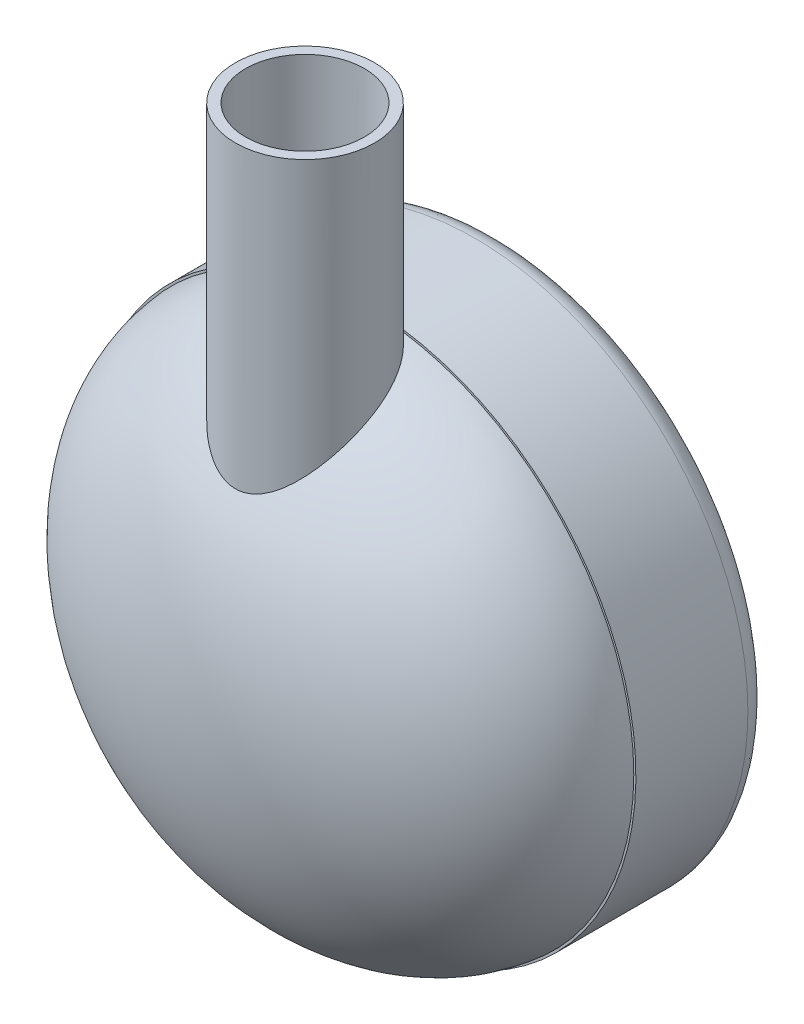
ISO-10303-21;
HEADER;
FILE_DESCRIPTION(('STEP AP214'),'2;1');
FILE_NAME('part.step','',(''),(''),'','','');
FILE_SCHEMA(('AUTOMOTIVE_DESIGN { 1 0 10303 214 1 1 1 1 }'));
ENDSEC;
DATA;
#1=APPLICATION_CONTEXT('core data for automotive mechanical design processes');
#2=APPLICATION_PROTOCOL_DEFINITION('international standard','automotive_design',2000,#1);
#3=PRODUCT_CONTEXT('',#1,'mechanical');
#4=PRODUCT('Part','Part','',(#3));
#5=PRODUCT_RELATED_PRODUCT_CATEGORY('part','',(#4));
#6=PRODUCT_DEFINITION_FORMATION('','',#4);
#7=PRODUCT_DEFINITION_CONTEXT('part definition',#1,'design');
#8=PRODUCT_DEFINITION('design','',#6,#7);
#9=PRODUCT_DEFINITION_SHAPE('','',#8);
#10=(LENGTH_UNIT() NAMED_UNIT(*) SI_UNIT(.MILLI.,.METRE.));
#11=(NAMED_UNIT(*) PLANE_ANGLE_UNIT() SI_UNIT($,.RADIAN.));
#12=(NAMED_UNIT(*) SI_UNIT($,.STERADIAN.) SOLID_ANGLE_UNIT());
#13=UNCERTAINTY_MEASURE_WITH_UNIT(LENGTH_MEASURE(1.E-05),#10,'distance_accuracy_value','');
#14=(GEOMETRIC_REPRESENTATION_CONTEXT(3) GLOBAL_UNCERTAINTY_ASSIGNED_CONTEXT((#13)) GLOBAL_UNIT_ASSIGNED_CONTEXT((#10,
#11,#12)) REPRESENTATION_CONTEXT('',''));
#15=CARTESIAN_POINT('',(0.,0.,0.));
#16=DIRECTION('',(0.,0.,1.));
#17=DIRECTION('',(1.,0.,0.));
#18=AXIS2_PLACEMENT_3D('',#15,#16,#17);
#19=CARTESIAN_POINT('',(0.,0.,45.));
#20=DIRECTION('',(0.,0.,-1.));
#21=DIRECTION('',(-1.,0.,0.));
#22=AXIS2_PLACEMENT_3D('',#19,#20,#21);
#23=CYLINDRICAL_SURFACE('',#22,120.75);
#24=CARTESIAN_POINT('',(0.,0.,0.));
#25=DIRECTION('',(0.,0.,-1.));
#26=DIRECTION('',(-1.,0.,0.));
#27=AXIS2_PLACEMENT_3D('',#24,#25,#26);
#28=CIRCLE('',#27,120.75);
#29=CARTESIAN_POINT('',(-120.75,0.,0.));
#30=VERTEX_POINT('',#29);
#31=EDGE_CURVE('E157',#30,#30,#28,.F.);
#32=ORIENTED_EDGE('',*,*,#31,.T.);
#33=EDGE_LOOP('',(#32));
#34=FACE_BOUND('',#33,.T.);
#35=CARTESIAN_POINT('',(17.1846588560844,119.520918671168,49.5));
#36=CARTESIAN_POINT('',(16.8331317271554,119.571462089514,49.2631043339135));
#37=CARTESIAN_POINT('',(16.4766605983604,119.62113092861,49.0334458264158));
#38=CARTESIAN_POINT('',(15.7543172902468,119.718406265614,48.58894383915));
#39=CARTESIAN_POINT('',(15.38844497596,119.766012733886,48.3741005722405));
#40=CARTESIAN_POINT('',(14.2775585035009,119.905255814066,47.7523629909278));
#41=CARTESIAN_POINT('',(13.5191925403778,119.993328044487,47.3682054450091));
#42=CARTESIAN_POINT('',(11.9721185922926,120.157547566686,46.6635619864697));
#43=CARTESIAN_POINT('',(11.183404958892,120.233692625022,46.3430879960006));
#44=CARTESIAN_POINT('',(9.58103277847739,120.371976729414,45.7683282808845));
#45=CARTESIAN_POINT('',(8.767375648652,120.434116569521,45.514038803663));
#46=CARTESIAN_POINT('',(7.11975880411299,120.542747381812,45.073429184804));
#47=CARTESIAN_POINT('',(6.28577540860014,120.58921906402,44.8871928038176));
#48=CARTESIAN_POINT('',(4.60441577754682,120.665115064772,44.5846836838166));
#49=CARTESIAN_POINT('',(3.75703919370377,120.69453893922,44.4684127674028));
#50=CARTESIAN_POINT('',(2.0556109289948,120.735498751539,44.3068936945759));
#51=CARTESIAN_POINT('',(1.20156343729171,120.747045130363,44.2616040829242));
#52=CARTESIAN_POINT('',(-0.507361239728997,120.751957110458,44.2423140637511));
#53=CARTESIAN_POINT('',(-1.362238392966,120.745323388733,44.2683110016084));
#54=CARTESIAN_POINT('',(-3.0524350075147,120.714323042628,44.3903419533874));
#55=CARTESIAN_POINT('',(-3.8878442359368,120.69025121979,44.485211687873));
#56=CARTESIAN_POINT('',(-5.54750209458255,120.625360044033,44.7428849386943));
#57=CARTESIAN_POINT('',(-6.37175004546557,120.584539676389,44.9056925711096));
#58=CARTESIAN_POINT('',(-8.00327374212154,120.48725189432,45.2979137992242));
#59=CARTESIAN_POINT('',(-8.81055015422372,120.430785095437,45.5273247747149));
#60=CARTESIAN_POINT('',(-10.4023796465315,120.303743645905,46.050818627233));
#61=CARTESIAN_POINT('',(-11.1869386507159,120.233172711797,46.3448844692769));
#62=CARTESIAN_POINT('',(-12.874319527206,120.06523963759,47.0571419790517));
#63=CARTESIAN_POINT('',(-13.7714818434274,119.965334833389,47.4882880818536));
#64=CARTESIAN_POINT('',(-15.0804306161338,119.805410419278,48.197220221686));
#65=CARTESIAN_POINT('',(-15.5101725119268,119.750488788359,48.4436018574173));
#66=CARTESIAN_POINT('',(-16.3570711100357,119.637749819806,48.9566948745404));
#67=CARTESIAN_POINT('',(-16.774225305514,119.579931911398,49.2234102685832));
#68=CARTESIAN_POINT('',(-17.1846588560844,119.520918671168,49.5));
#69=B_SPLINE_CURVE_WITH_KNOTS('',3,(#35,#36,#37,#38,#39,#40,#41,#42,#43,#44,#45,#46,#47,#48,#49,
#50,#51,#52,#53,#54,#55,#56,#57,#58,#59,#60,#61,#62,#63,#64,#65,#66,#67,#68),.UNSPECIFIED.,.F.,
.F.,(4,2,2,2,2,2,2,2,2,2,2,2,2,2,2,2,4),(0.,1.2805175942582,2.56105358257562,5.12182669012851,
7.68307874742409,10.244185553463,12.8084340697541,15.372749381844,17.935566497049,
20.4982881774684,23.0186674745591,25.5391994933089,28.0596323665073,30.579401961095,
33.5752101749079,35.0699067913225,36.5648991375559),.UNSPECIFIED.);
#70=CARTESIAN_POINT('',(17.1846588560844,119.520918671168,49.5));
#71=VERTEX_POINT('',#70);
#72=CARTESIAN_POINT('',(-17.1846588560844,119.520918671168,49.5));
#73=VERTEX_POINT('',#72);
#74=EDGE_CURVE('E11',#71,#73,#69,.T.);
#75=ORIENTED_EDGE('',*,*,#74,.F.);
#76=CARTESIAN_POINT('',(0.,0.,49.5));
#77=DIRECTION('',(0.,0.,1.));
#78=DIRECTION('',(1.,0.,0.));
#79=AXIS2_PLACEMENT_3D('',#76,#77,#78);
#80=CIRCLE('',#79,120.75);
#81=EDGE_CURVE('E158',#73,#71,#80,.T.);
#82=ORIENTED_EDGE('',*,*,#81,.F.);
#83=EDGE_LOOP('',(#75,#82));
#84=FACE_BOUND('',#83,.T.);
#85=ADVANCED_FACE('F39',(#34,#84),#23,.T.);
#86=CARTESIAN_POINT('',(0.,0.,49.5));
#87=DIRECTION('',(0.,0.,1.));
#88=DIRECTION('',(1.,0.,0.));
#89=AXIS2_PLACEMENT_3D('',#86,#87,#88);
#90=PLANE('',#89);
#91=CARTESIAN_POINT('',(0.,0.,49.5));
#92=DIRECTION('',(0.,0.,1.));
#93=DIRECTION('',(1.,0.,0.));
#94=AXIS2_PLACEMENT_3D('',#91,#92,#93);
#95=CIRCLE('',#94,119.810793454518);
#96=CARTESIAN_POINT('',(17.1846588560844,118.571976993728,49.5));
#97=VERTEX_POINT('',#96);
#98=CARTESIAN_POINT('',(-17.1846588560843,118.571976993728,49.5));
#99=VERTEX_POINT('',#98);
#100=EDGE_CURVE('E162',#97,#99,#95,.F.);
#101=ORIENTED_EDGE('',*,*,#100,.T.);
#102=DIRECTION('',(0.,-1.,0.));
#103=VECTOR('',#102,1.);
#104=CARTESIAN_POINT('',(-17.1846588560844,210.,49.5));
#105=LINE('',#104,#103);
#106=EDGE_CURVE('E54',#99,#73,#105,.F.);
#107=ORIENTED_EDGE('',*,*,#106,.T.);
#108=ORIENTED_EDGE('',*,*,#81,.T.);
#109=DIRECTION('',(0.,-1.,0.));
#110=VECTOR('',#109,1.);
#111=CARTESIAN_POINT('',(17.1846588560844,210.,49.5));
#112=LINE('',#111,#110);
#113=EDGE_CURVE('E172',#71,#97,#112,.T.);
#114=ORIENTED_EDGE('',*,*,#113,.T.);
#115=EDGE_LOOP('',(#101,#107,#108,#114));
#116=FACE_BOUND('',#115,.T.);
#117=ADVANCED_FACE('F134',(#116),#90,.T.);
#118=CARTESIAN_POINT('',(0.,0.,45.015));
#119=DIRECTION('',(0.,1.,0.));
#120=DIRECTION('',(1.,0.,0.));
#121=AXIS2_PLACEMENT_3D('',#118,#119,#120);
#122=ELLIPSE('',#121,115.5,75.);
#123=TRIMMED_CURVE('',#122,(PARAMETER_VALUE(4.71238898038469)),
(PARAMETER_VALUE(7.85398163397448)),.T.,.PARAMETER.);
#124=CARTESIAN_POINT('',(0.,0.,-29.985));
#125=DIRECTION('',(0.,0.,1.));
#126=AXIS1_PLACEMENT('',#124,#125);
#127=SURFACE_OF_REVOLUTION('',#123,#126);
#128=OFFSET_SURFACE('',#127,-4.5,.F.);
#129=ORIENTED_EDGE('',*,*,#100,.F.);
#130=CARTESIAN_POINT('',(1.80989121084306,77.6819857807025,105.69669027444));
#131=CARTESIAN_POINT('',(1.40669043917153,77.648988087684,105.720461887101));
#132=CARTESIAN_POINT('',(1.00209316683736,77.6269195285293,105.736336908205));
#133=CARTESIAN_POINT('',(0.191786023032918,77.605043189585,105.752073809219));
#134=CARTESIAN_POINT('',(-0.213924321867369,77.6052471297828,105.751927258434));
#135=CARTESIAN_POINT('',(-1.02441679202699,77.6279380095596,105.735604089678));
#136=CARTESIAN_POINT('',(-1.42919887620898,77.650425916878,105.719426775529));
#137=CARTESIAN_POINT('',(-2.23661175701627,77.7173367709566,105.671222617045));
#138=CARTESIAN_POINT('',(-2.63923829546314,77.7617933491522,105.639171471585));
#139=CARTESIAN_POINT('',(-3.44001507677279,77.871891643151,105.55962490904));
#140=CARTESIAN_POINT('',(-3.83816552292512,77.9375323927829,105.512130196308));
#141=CARTESIAN_POINT('',(-4.62848091282559,78.0889197979008,105.402284338547));
#142=CARTESIAN_POINT('',(-5.020646201604,78.1746652896971,105.339934053376));
#143=CARTESIAN_POINT('',(-5.98587933731249,78.411067560125,105.167443446823));
#144=CARTESIAN_POINT('',(-6.55468713551867,78.5730595711758,105.048775505419));
#145=CARTESIAN_POINT('',(-7.673423566329,78.9338363336602,104.782745166043));
#146=CARTESIAN_POINT('',(-8.22335206210646,79.1326213516824,104.635382560161));
#147=CARTESIAN_POINT('',(-9.3028549452519,79.5622531006128,104.314444140331));
#148=CARTESIAN_POINT('',(-9.83242009136616,79.7931141739918,104.14085659713));
#149=CARTESIAN_POINT('',(-10.8702169610005,80.282301273951,103.769857602816));
#150=CARTESIAN_POINT('',(-11.3784418220434,80.5406360424255,103.57243856601));
#151=CARTESIAN_POINT('',(-12.267371580735,81.0231044281979,103.200254185229));
#152=CARTESIAN_POINT('',(-12.6522161823482,81.2428328786841,103.029595697287));
#153=CARTESIAN_POINT('',(-13.4084284386805,81.6948126589588,102.67581518848));
#154=CARTESIAN_POINT('',(-13.7797987412217,81.9270615058325,102.492695636888));
#155=CARTESIAN_POINT('',(-14.8744776748682,82.6404206692222,101.925607779527));
#156=CARTESIAN_POINT('',(-15.5780772385715,83.1379907006384,101.524027552144));
#157=CARTESIAN_POINT('',(-16.9358181374531,84.1668161349365,100.678430353881));
#158=CARTESIAN_POINT('',(-17.5898433750881,84.6981455601085,100.234318965262));
#159=CARTESIAN_POINT('',(-18.848995172111,85.7849213077496,99.308198586273));
#160=CARTESIAN_POINT('',(-19.4541240168251,86.3403665012252,98.8261913691639));
#161=CARTESIAN_POINT('',(-20.5915320134628,87.4435312301171,97.8492474790699));
#162=CARTESIAN_POINT('',(-21.1258511231682,87.9905023615386,97.3558303131987));
#163=CARTESIAN_POINT('',(-22.1528473274034,89.0956074096433,96.3386116726273));
#164=CARTESIAN_POINT('',(-22.6455105801531,89.653744961213,95.8148001949717));
#165=CARTESIAN_POINT('',(-23.5897308699754,90.7770595260125,94.7382816614395));
#166=CARTESIAN_POINT('',(-24.0412814527677,91.3422376287606,94.1855700899038));
#167=CARTESIAN_POINT('',(-24.9036654366512,92.4764921797058,93.052074494395));
#168=CARTESIAN_POINT('',(-25.3144704222209,93.045571056648,92.4712712937663));
#169=CARTESIAN_POINT('',(-26.0946329197528,94.1840806896701,91.2830483349029));
#170=CARTESIAN_POINT('',(-26.4639977183918,94.7535113661294,90.6756332821905));
#171=CARTESIAN_POINT('',(-27.1606166593839,95.8900651003905,89.4350082393035));
#172=CARTESIAN_POINT('',(-27.4878713153999,96.4571881862586,88.8017985638979));
#173=CARTESIAN_POINT('',(-28.0253520403908,97.4502976239254,87.6663281103067));
#174=CARTESIAN_POINT('',(-28.2447681525781,97.8773375313495,87.1693141970684));
#175=CARTESIAN_POINT('',(-28.6580166174198,98.727549529245,86.1614184408254));
#176=CARTESIAN_POINT('',(-28.8518466635156,99.1507212678085,85.6505353525267));
#177=CARTESIAN_POINT('',(-29.2131216331597,99.9921231047379,84.6154325915189));
#178=CARTESIAN_POINT('',(-29.3805636161198,100.410352647567,84.0912114400146));
#179=CARTESIAN_POINT('',(-29.6881266761399,101.240756741045,83.0301152363319));
#180=CARTESIAN_POINT('',(-29.8282483651303,101.652931427121,82.4932404678759));
#181=CARTESIAN_POINT('',(-30.0799349795175,102.469434536016,81.4085424899584));
#182=CARTESIAN_POINT('',(-30.1915514195129,102.873775874974,80.8607409875005));
#183=CARTESIAN_POINT('',(-30.3854541067728,103.674277826471,79.7541731183133));
#184=CARTESIAN_POINT('',(-30.4677440587579,104.070439466364,79.1954081459796));
#185=CARTESIAN_POINT('',(-30.6018313761142,104.853485315592,78.0679902488535));
#186=CARTESIAN_POINT('',(-30.6536364878264,105.240371857784,77.4993398738328));
#187=CARTESIAN_POINT('',(-30.7255719350372,106.003860601573,76.3532921326368));
#188=CARTESIAN_POINT('',(-30.7457050156939,106.380463691703,75.7758955289171));
#189=CARTESIAN_POINT('',(-30.7547422595682,107.291921763317,74.3480628718924));
#190=CARTESIAN_POINT('',(-30.7251794727656,107.820480037013,73.4933880701209));
#191=CARTESIAN_POINT('',(-30.5924193548719,108.850321983771,71.7735289978748));
#192=CARTESIAN_POINT('',(-30.4892338054832,109.351610007024,70.9083464307096));
#193=CARTESIAN_POINT('',(-30.205799682476,110.323806582743,69.1738458472711));
#194=CARTESIAN_POINT('',(-30.0255779832139,110.794725663659,68.3045293776094));
#195=CARTESIAN_POINT('',(-29.5850813264832,111.703634683419,66.5686964573215));
#196=CARTESIAN_POINT('',(-29.3248040503778,112.141623668058,65.7021800885287));
#197=CARTESIAN_POINT('',(-28.8213384205952,112.84398222546,64.263707414053));
#198=CARTESIAN_POINT('',(-28.600648545407,113.118102790591,63.6885406434975));
#199=CARTESIAN_POINT('',(-28.1219787154833,113.64987323533,62.5460736744658));
#200=CARTESIAN_POINT('',(-27.8639978486577,113.907522711854,61.9787736687727));
#201=CARTESIAN_POINT('',(-27.3106979216999,114.405877991641,60.8550166830319));
#202=CARTESIAN_POINT('',(-27.0153780143282,114.646583410243,60.2985599493536));
#203=CARTESIAN_POINT('',(-26.3877624974977,115.110672276387,59.1997256146788));
#204=CARTESIAN_POINT('',(-26.0554801166479,115.33406187288,58.6573430617937));
#205=CARTESIAN_POINT('',(-25.3544120301639,115.76347682655,57.5895387199744));
#206=CARTESIAN_POINT('',(-24.9856265892381,115.969502309625,57.0641168080838));
#207=CARTESIAN_POINT('',(-24.2125303361332,116.364178730038,56.0334258872613));
#208=CARTESIAN_POINT('',(-23.8082245286772,116.552832107411,55.5281540537774));
#209=CARTESIAN_POINT('',(-22.8270793940527,116.971992147876,54.3789111764738));
#210=CARTESIAN_POINT('',(-22.2370961716108,117.195974600735,53.7437024275815));
#211=CARTESIAN_POINT('',(-21.000236318134,117.614482630452,52.5209219692862));
#212=CARTESIAN_POINT('',(-20.3533642438159,117.809010563185,51.9333464517607));
#213=CARTESIAN_POINT('',(-19.007333264297,118.169817002312,50.8121776571229));
#214=CARTESIAN_POINT('',(-18.3081867430122,118.336102169124,50.2785716645585));
#215=CARTESIAN_POINT('',(-16.8627363441075,118.641941986431,49.2708964333779));
#216=CARTESIAN_POINT('',(-16.1164334823478,118.781497212491,48.7968259128824));
#217=CARTESIAN_POINT('',(-14.6258590513366,119.028319065918,47.9381392908444));
#218=CARTESIAN_POINT('',(-13.8838506842341,119.136963616934,47.5499842936186));
#219=CARTESIAN_POINT('',(-12.3683700370362,119.33326197722,46.834631978436));
#220=CARTESIAN_POINT('',(-11.5948992010565,119.420916748645,46.5074318665103));
#221=CARTESIAN_POINT('',(-10.0220875552169,119.576520084698,45.916914567264));
#222=CARTESIAN_POINT('',(-9.22274841937384,119.644469921669,45.653593255483));
#223=CARTESIAN_POINT('',(-7.60389972672945,119.761794555705,45.1930981965814));
#224=CARTESIAN_POINT('',(-6.78438999842554,119.811169194774,44.9959250121009));
#225=CARTESIAN_POINT('',(-5.13632115069617,119.891977278374,44.6704469382079));
#226=CARTESIAN_POINT('',(-4.30785157266456,119.923521796227,44.5417159910169));
#227=CARTESIAN_POINT('',(-2.64270860955412,119.969744129351,44.352312834691));
#228=CARTESIAN_POINT('',(-1.80603528542958,119.984422069846,44.2916401202658));
#229=CARTESIAN_POINT('',(-0.130385699817487,119.997199183182,44.2388530184595));
#230=CARTESIAN_POINT('',(0.708590608816866,119.995298014045,44.2467400452595));
#231=CARTESIAN_POINT('',(2.38289575321601,119.97487849947,44.331010630303));
#232=CARTESIAN_POINT('',(3.21822457735905,119.956360101124,44.4073944066337));
#233=CARTESIAN_POINT('',(4.88114060865462,119.902286146119,44.6282694046959));
#234=CARTESIAN_POINT('',(5.70870681825982,119.866693311754,44.7729096358015));
#235=CARTESIAN_POINT('',(7.34833445032561,119.777786587757,45.12913970604));
#236=CARTESIAN_POINT('',(8.16039586348807,119.724472687497,45.3407295853206));
#237=CARTESIAN_POINT('',(9.76318493549764,119.599189000412,45.8290464533183));
#238=CARTESIAN_POINT('',(10.5539133776987,119.527219899646,46.1057710466278));
#239=CARTESIAN_POINT('',(12.1084157333329,119.363474102666,46.7219556098767));
#240=CARTESIAN_POINT('',(12.8721897271162,119.271697465505,47.0614153927861));
#241=CARTESIAN_POINT('',(14.3661897755792,119.067200128134,47.7994815699164));
#242=CARTESIAN_POINT('',(15.0964659113372,118.954512055034,48.1979956320733));
#243=CARTESIAN_POINT('',(16.5196003557735,118.706749443258,49.050944153048));
#244=CARTESIAN_POINT('',(17.2124588045098,118.571674988384,49.5053784025303));
#245=CARTESIAN_POINT('',(18.5559395687081,118.277835716534,50.4659130610367));
#246=CARTESIAN_POINT('',(19.2065663056842,118.119073385356,50.9720080470412));
#247=CARTESIAN_POINT('',(20.4613871765184,117.776654010937,52.0311466701762));
#248=CARTESIAN_POINT('',(21.0655813147189,117.592996970024,52.5841903029162));
#249=CARTESIAN_POINT('',(22.224312254952,117.199646415238,53.7324591480665));
#250=CARTESIAN_POINT('',(22.7788077046281,116.989931559573,54.3277187625389));
#251=CARTESIAN_POINT('',(23.8345324123773,116.5438976485,55.5543734762603));
#252=CARTESIAN_POINT('',(24.3357619162907,116.307578715888,56.1857684087119));
#253=CARTESIAN_POINT('',(25.2826499662419,115.807998801254,57.4788053208395));
#254=CARTESIAN_POINT('',(25.7283087251077,115.544737922422,58.1404471846609));
#255=CARTESIAN_POINT('',(26.5625364542161,114.991317676626,59.4879987835267));
#256=CARTESIAN_POINT('',(26.9511042047193,114.701157735184,60.1739090366727));
#257=CARTESIAN_POINT('',(27.6813494055378,114.085130858031,61.5852414686752));
#258=CARTESIAN_POINT('',(28.0212391598422,113.758445782259,62.3112308205877));
#259=CARTESIAN_POINT('',(28.6395961449899,113.077858563005,63.7764346517828));
#260=CARTESIAN_POINT('',(28.9180624436534,112.723956006572,64.5156493315927));
#261=CARTESIAN_POINT('',(29.414381793041,111.990091903199,66.0016416826106));
#262=CARTESIAN_POINT('',(29.6322200665523,111.610124031291,66.7484211517403));
#263=CARTESIAN_POINT('',(30.0085720545267,110.825747723633,68.2440502316187));
#264=CARTESIAN_POINT('',(30.1670831935345,110.42133822773,68.9928999308171));
#265=CARTESIAN_POINT('',(30.4390323572864,109.550080910936,70.5594201880532));
#266=CARTESIAN_POINT('',(30.546712623055,109.080960045725,71.3768259353888));
#267=CARTESIAN_POINT('',(30.6959527849908,108.11804295037,73.0030376130043));
#268=CARTESIAN_POINT('',(30.737508996098,107.624245346586,73.8118430614992));
#269=CARTESIAN_POINT('',(30.7576499603902,106.614541953106,75.4165190952669));
#270=CARTESIAN_POINT('',(30.7362201907736,106.098631091739,76.2123866548833));
#271=CARTESIAN_POINT('',(30.6335803417831,105.047538958255,77.7873111592285));
#272=CARTESIAN_POINT('',(30.5523673392081,104.51235674505,78.5663672800164));
#273=CARTESIAN_POINT('',(30.3149731710234,103.334603272388,80.233276075383));
#274=CARTESIAN_POINT('',(30.1485320655086,102.689031512063,81.1175541903192));
#275=CARTESIAN_POINT('',(29.7430784790947,101.379695372433,82.8554550206369));
#276=CARTESIAN_POINT('',(29.504058672246,100.715929162772,83.7090746316789));
#277=CARTESIAN_POINT('',(28.9571615262657,99.3738072891922,85.3837442814458));
#278=CARTESIAN_POINT('',(28.649204563488,98.6954355811954,86.204755355157));
#279=CARTESIAN_POINT('',(27.9678784909189,97.3292064028397,87.8109875318415));
#280=CARTESIAN_POINT('',(27.5945075354592,96.6413486653351,88.5962076241775));
#281=CARTESIAN_POINT('',(26.8681570601291,95.4028247106367,89.9712558843057));
#282=CARTESIAN_POINT('',(26.5267798732931,94.8530416353658,90.5680528984697));
#283=CARTESIAN_POINT('',(25.8050878286605,93.7527413547414,91.7371420837408));
#284=CARTESIAN_POINT('',(25.4247674639174,93.2022240564553,92.3094307728582));
#285=CARTESIAN_POINT('',(24.6255994984597,92.1030651551525,93.4286548917379));
#286=CARTESIAN_POINT('',(24.2067431760277,91.5544240060443,93.9755845397375));
#287=CARTESIAN_POINT('',(23.3308424825444,90.4623670721967,95.0427182150438));
#288=CARTESIAN_POINT('',(22.873818282027,89.9189486945947,95.5629361268604));
#289=CARTESIAN_POINT('',(21.9211046026771,88.8405229152736,96.5757027187412));
#290=CARTESIAN_POINT('',(21.425422911483,88.3055138454401,97.0682569375036));
#291=CARTESIAN_POINT('',(20.3946931635759,87.2479568520541,98.0241802501265));
#292=CARTESIAN_POINT('',(19.8596606166976,86.7254041253226,98.487560710354));
#293=CARTESIAN_POINT('',(18.7715779226584,85.7183777244785,99.3651117504399));
#294=CARTESIAN_POINT('',(18.2201619989749,85.2332209225829,99.7805202862638));
#295=CARTESIAN_POINT('',(17.0784415608994,84.2837300118062,100.580760344029));
#296=CARTESIAN_POINT('',(16.4881377656024,83.8193955181562,100.965592431084));
#297=CARTESIAN_POINT('',(15.2677739941574,82.9184213453848,101.701399782235));
#298=CARTESIAN_POINT('',(14.6377580077186,82.4817520604116,102.052411456149));
#299=CARTESIAN_POINT('',(13.33608708406,81.6435312046969,102.717233338622));
#300=CARTESIAN_POINT('',(12.6644456021872,81.2419683860073,103.031055474078));
#301=CARTESIAN_POINT('',(11.4654103017645,80.5857652626005,103.537850273421));
#302=CARTESIAN_POINT('',(10.9478613988872,80.3206752255197,103.740612589813));
#303=CARTESIAN_POINT('',(9.89027081333018,79.8188230045038,104.121484208536));
#304=CARTESIAN_POINT('',(9.35022857251082,79.5820615240662,104.299592898648));
#305=CARTESIAN_POINT('',(8.2500014401465,79.1423368399254,104.628175644279));
#306=CARTESIAN_POINT('',(7.6898698003252,78.9392913063061,104.778717110673));
#307=CARTESIAN_POINT('',(6.55022443825492,78.5714708970443,105.049952576066));
#308=CARTESIAN_POINT('',(5.97072037042059,78.4066772741586,105.170661198014));
#309=CARTESIAN_POINT('',(5.09201776287559,78.1925046706985,105.326909991042));
#310=CARTESIAN_POINT('',(4.79885634846773,78.1268349242314,105.374700180671));
#311=CARTESIAN_POINT('',(4.20905701878583,78.006621166336,105.462028008659));
#312=CARTESIAN_POINT('',(3.91241955615468,77.952075722983,105.501566709168));
#313=CARTESIAN_POINT('',(3.31610292600799,77.8545711024999,105.57214664402));
#314=CARTESIAN_POINT('',(3.01642246251066,77.8116170969386,105.603184085582));
#315=CARTESIAN_POINT('',(2.41472142050117,77.7377134111939,105.656530867552));
#316=CARTESIAN_POINT('',(2.11270014295983,77.7067674698441,105.678837489549));
#317=CARTESIAN_POINT('',(1.80989121084306,77.6819857807025,105.69669027444));
#318=B_SPLINE_CURVE_WITH_KNOTS('',3,(#130,#131,#132,#133,#134,#135,#136,#137,#138,#139,#140,
#141,#142,#143,#144,#145,#146,#147,#148,#149,#150,#151,#152,#153,#154,#155,#156,#157,#158,#159,
#160,#161,#162,#163,#164,#165,#166,#167,#168,#169,#170,#171,#172,#173,#174,#175,#176,#177,#178,
#179,#180,#181,#182,#183,#184,#185,#186,#187,#188,#189,#190,#191,#192,#193,#194,#195,#196,#197,
#198,#199,#200,#201,#202,#203,#204,#205,#206,#207,#208,#209,#210,#211,#212,#213,#214,#215,#216,
#217,#218,#219,#220,#221,#222,#223,#224,#225,#226,#227,#228,#229,#230,#231,#232,#233,#234,#235,
#236,#237,#238,#239,#240,#241,#242,#243,#244,#245,#246,#247,#248,#249,#250,#251,#252,#253,#254,
#255,#256,#257,#258,#259,#260,#261,#262,#263,#264,#265,#266,#267,#268,#269,#270,#271,#272,#273,
#274,#275,#276,#277,#278,#279,#280,#281,#282,#283,#284,#285,#286,#287,#288,#289,#290,#291,#292,
#293,#294,#295,#296,#297,#298,#299,#300,#301,#302,#303,#304,#305,#306,#307,#308,#309,#310,#311,
#312,#313,#314,#315,#316,#317),.UNSPECIFIED.,.T.,.F.,(4,2,2,2,2,2,2,2,2,2,2,2,2,2,2,2,2,2,2,2,2,
2,2,2,2,2,2,2,2,2,2,2,2,2,2,2,2,2,2,2,2,2,2,2,2,2,2,2,2,2,2,2,2,2,2,2,2,2,2,2,2,2,2,2,2,2,2,2,2,
2,2,2,2,2,2,2,2,2,2,2,2,2,2,2,2,2,2,2,2,2,2,2,2,4),(0.,1.2155685070668,2.43177666018528,
3.64803763262601,4.866166351973,6.08423952254601,7.30224220678737,9.10945043052905,
10.9166717491489,12.7247037640209,14.5333128102766,15.9574134776825,17.3812327637445,
20.2298801976798,23.0850049779274,25.9399962376832,28.6684704458223,31.3978477615472,
34.1276528262007,36.8593484346597,39.5905629573779,42.3217441613608,44.3942705673289,
46.4669836820926,48.5399276092706,50.6128251005262,52.6819495171854,54.7508124553043,
56.8191494583665,58.8873071794233,61.900219615036,64.9126500084469,67.9240303605242,
70.9354979389415,72.9572077785351,74.9789670749388,77.0007722541967,79.0218561576241,
81.042925405879,83.0637103462694,85.7462258711494,88.4285267256741,91.1101941391998,
93.7918038028936,96.3220464488919,98.8521730884443,101.382136321881,103.912121074032,
106.426166414471,108.94019308955,111.454271621549,113.968358158168,116.487958720717,
119.007560794205,121.527070220771,124.04657213615,126.56217555092,129.077769548885,
131.593099746625,134.108429709133,136.625833519071,139.143225709837,141.660608259055,
144.178044583892,146.772122763983,149.366240309829,151.960989582057,154.555851482105,
157.398784895413,160.241876738406,163.085624170107,165.929510660829,169.248635714289,
172.568095905052,175.89141009752,179.21481807304,181.854636043155,184.494827826247,
187.135618632221,189.775022588142,192.413896196892,195.051735231046,197.581588659619,
200.11139532054,202.638447319438,205.164686672499,207.010822391609,208.857003947238,
210.698608875844,212.539309320032,213.451644066842,214.363861303347,215.276484859056,
216.189392341881),.UNSPECIFIED.);
#319=EDGE_CURVE('E159',#97,#99,#318,.T.);
#320=ORIENTED_EDGE('',*,*,#319,.T.);
#321=EDGE_LOOP('',(#129,#320));
#322=FACE_BOUND('',#321,.T.);
#323=CARTESIAN_POINT('',(0.,0.,124.515));
#324=VERTEX_POINT('',#323);
#325=VERTEX_LOOP('',#324);
#326=FACE_BOUND('',#325,.T.);
#327=ADVANCED_FACE('F139',(#322,#326),#128,.F.);
#328=CARTESIAN_POINT('',(0.,0.,0.));
#329=DIRECTION('',(0.,-1.,0.));
#330=DIRECTION('',(1.,0.,0.));
#331=AXIS2_PLACEMENT_3D('',#328,#329,#330);
#332=ELLIPSE('',#331,116.25,22.5);
#333=TRIMMED_CURVE('',#332,(PARAMETER_VALUE(4.71238898038469)),
(PARAMETER_VALUE(7.85398163397448)),.T.,.PARAMETER.);
#334=CARTESIAN_POINT('',(0.,0.,22.5));
#335=DIRECTION('',(0.,0.,-1.));
#336=AXIS1_PLACEMENT('',#334,#335);
#337=SURFACE_OF_REVOLUTION('',#333,#336);
#338=OFFSET_SURFACE('',#337,-4.5,.F.);
#339=CARTESIAN_POINT('',(0.,0.,-27.));
#340=VERTEX_POINT('',#339);
#341=VERTEX_LOOP('',#340);
#342=FACE_BOUND('',#341,.T.);
#343=ORIENTED_EDGE('',*,*,#31,.F.);
#344=EDGE_LOOP('',(#343));
#345=FACE_BOUND('',#344,.T.);
#346=ADVANCED_FACE('F147',(#342,#345),#338,.F.);
#347=CARTESIAN_POINT('',(0.,210.,75.));
#348=DIRECTION('',(0.,-1.,0.));
#349=DIRECTION('',(0.,0.,-1.));
#350=AXIS2_PLACEMENT_3D('',#347,#348,#349);
#351=CYLINDRICAL_SURFACE('',#350,30.75);
#352=ORIENTED_EDGE('',*,*,#113,.F.);
#353=ORIENTED_EDGE('',*,*,#74,.T.);
#354=ORIENTED_EDGE('',*,*,#106,.F.);
#355=ORIENTED_EDGE('',*,*,#319,.F.);
#356=EDGE_LOOP('',(#352,#353,#354,#355));
#357=FACE_BOUND('',#356,.T.);
#358=CARTESIAN_POINT('',(0.,210.,75.));
#359=DIRECTION('',(0.,1.,0.));
#360=DIRECTION('',(0.,0.,1.));
#361=AXIS2_PLACEMENT_3D('',#358,#359,#360);
#362=CIRCLE('',#361,30.75);
#363=CARTESIAN_POINT('',(0.,210.,105.75));
#364=VERTEX_POINT('',#363);
#365=EDGE_CURVE('E165',#364,#364,#362,.T.);
#366=ORIENTED_EDGE('',*,*,#365,.F.);
#367=EDGE_LOOP('',(#366));
#368=FACE_BOUND('',#367,.T.);
#369=ADVANCED_FACE('F144',(#357,#368),#351,.T.);
#370=CARTESIAN_POINT('',(0.,210.,75.));
#371=DIRECTION('',(0.,1.,0.));
#372=DIRECTION('',(0.,0.,1.));
#373=AXIS2_PLACEMENT_3D('',#370,#371,#372);
#374=PLANE('',#373);
#375=CARTESIAN_POINT('',(0.,210.,75.));
#376=DIRECTION('',(0.,1.,0.));
#377=DIRECTION('',(0.,0.,1.));
#378=AXIS2_PLACEMENT_3D('',#375,#376,#377);
#379=CIRCLE('',#378,26.25);
#380=CARTESIAN_POINT('',(0.,210.,101.25));
#381=VERTEX_POINT('',#380);
#382=EDGE_CURVE('E94',#381,#381,#379,.T.);
#383=ORIENTED_EDGE('',*,*,#382,.F.);
#384=EDGE_LOOP('',(#383));
#385=FACE_BOUND('',#384,.T.);
#386=ORIENTED_EDGE('',*,*,#365,.T.);
#387=EDGE_LOOP('',(#386));
#388=FACE_BOUND('',#387,.T.);
#389=ADVANCED_FACE('F86',(#385,#388),#374,.T.);
#390=CARTESIAN_POINT('',(0.,0.,45.015));
#391=DIRECTION('',(0.,1.,0.));
#392=DIRECTION('',(1.,0.,0.));
#393=AXIS2_PLACEMENT_3D('',#390,#391,#392);
#394=ELLIPSE('',#393,115.5,75.);
#395=TRIMMED_CURVE('',#394,(PARAMETER_VALUE(4.71238898038469)),
(PARAMETER_VALUE(7.85398163397448)),.T.,.PARAMETER.);
#396=CARTESIAN_POINT('',(0.,0.,-29.985));
#397=DIRECTION('',(0.,0.,1.));
#398=AXIS1_PLACEMENT('',#396,#397);
#399=SURFACE_OF_REVOLUTION('',#395,#398);
#400=CARTESIAN_POINT('',(0.,0.,45.015));
#401=DIRECTION('',(0.,0.,1.));
#402=DIRECTION('',(1.,0.,0.));
#403=AXIS2_PLACEMENT_3D('',#400,#401,#402);
#404=CIRCLE('',#403,115.5);
#405=CARTESIAN_POINT('',(115.5,0.,45.015));
#406=VERTEX_POINT('',#405);
#407=EDGE_CURVE('E97',#406,#406,#404,.T.);
#408=ORIENTED_EDGE('',*,*,#407,.F.);
#409=EDGE_LOOP('',(#408));
#410=FACE_BOUND('',#409,.T.);
#411=CARTESIAN_POINT('',(0.,0.,120.015));
#412=VERTEX_POINT('',#411);
#413=VERTEX_LOOP('',#412);
#414=FACE_BOUND('',#413,.T.);
#415=CARTESIAN_POINT('',(0.,115.356688780452,48.75));
#416=CARTESIAN_POINT('',(0.707103237303942,115.35668881342,48.7500002286974));
#417=CARTESIAN_POINT('',(1.41421061981578,115.34800239498,48.7785927178964));
#418=CARTESIAN_POINT('',(2.82338451515745,115.31314802089,48.8927078192648));
#419=CARTESIAN_POINT('',(3.52545099997355,115.286979968165,48.978230747566));
#420=CARTESIAN_POINT('',(4.91955639768857,115.216842710039,49.2054412268635));
#421=CARTESIAN_POINT('',(5.61159501356693,115.172872978473,49.3471304379671));
#422=CARTESIAN_POINT('',(6.98069074714374,115.066626854363,49.6853864054101));
#423=CARTESIAN_POINT('',(7.65774790223818,115.004350507521,49.8819530247507));
#424=CARTESIAN_POINT('',(8.99199758885814,114.860843542221,50.3281285671046));
#425=CARTESIAN_POINT('',(9.64919241892134,114.779615126523,50.5777313255366));
#426=CARTESIAN_POINT('',(10.9391700359492,114.597444101936,51.127658919058));
#427=CARTESIAN_POINT('',(11.5719528784648,114.496501537911,51.4279836387182));
#428=CARTESIAN_POINT('',(12.8086652315147,114.274115835106,52.0764739880572));
#429=CARTESIAN_POINT('',(13.4125974249457,114.152674607331,52.4246351575837));
#430=CARTESIAN_POINT('',(14.5876043292931,113.888515265266,53.1654706551755));
#431=CARTESIAN_POINT('',(15.1586789901684,113.745797118574,53.5581450510304));
#432=CARTESIAN_POINT('',(16.2661611985134,113.437891722485,54.3855899637907));
#433=CARTESIAN_POINT('',(16.8024455909281,113.272630461703,54.8204977224414));
#434=CARTESIAN_POINT('',(17.8350083756123,112.91949112072,55.7270399625684));
#435=CARTESIAN_POINT('',(18.3312868884544,112.731613108687,56.1986743333471));
#436=CARTESIAN_POINT('',(19.2811626146367,112.332942253389,57.174100241059));
#437=CARTESIAN_POINT('',(19.7347603058666,112.122149666752,57.677891417832));
#438=CARTESIAN_POINT('',(20.5972224244131,111.677607085806,58.7128662663114));
#439=CARTESIAN_POINT('',(21.0060859644611,111.443856636319,59.244050481031));
#440=CARTESIAN_POINT('',(21.7891418172673,110.946335176802,60.3451147445084));
#441=CARTESIAN_POINT('',(22.1619391801752,110.681877499136,60.9156760562813));
#442=CARTESIAN_POINT('',(22.8577226937591,110.129447087277,62.0754356889556));
#443=CARTESIAN_POINT('',(23.1807081174836,109.841474009996,62.6646342816967));
#444=CARTESIAN_POINT('',(23.7767526640681,109.242824084164,63.8567184622554));
#445=CARTESIAN_POINT('',(24.0498020870511,108.932142841007,64.4596066837177));
#446=CARTESIAN_POINT('',(24.5463381723544,108.289247080826,65.674212206312));
#447=CARTESIAN_POINT('',(24.7698228199556,107.957031689186,66.2859298652687));
#448=CARTESIAN_POINT('',(25.1856133706673,107.24239804241,67.5676281982443));
#449=CARTESIAN_POINT('',(25.3734746767095,106.858131172517,68.2380196700971));
#450=CARTESIAN_POINT('',(25.6934156575243,106.067600843528,69.5790943170578));
#451=CARTESIAN_POINT('',(25.8254924674618,105.661336255937,70.2497775053768));
#452=CARTESIAN_POINT('',(26.0360257417905,104.828725887934,71.5873229430661));
#453=CARTESIAN_POINT('',(26.1144650755235,104.402373738413,72.2541839043322));
#454=CARTESIAN_POINT('',(26.2200153020061,103.531815478527,73.5802232661388));
#455=CARTESIAN_POINT('',(26.2471237249597,103.087608510123,74.239401295497));
#456=CARTESIAN_POINT('',(26.2528678326327,102.111045320965,75.6517640473916));
#457=CARTESIAN_POINT('',(26.2230477392824,101.57596274759,76.4031022633379));
#458=CARTESIAN_POINT('',(26.1013292901633,100.487899804212,77.8875350442913));
#459=CARTESIAN_POINT('',(26.0094251069502,99.9349177587382,78.6206278900218));
#460=CARTESIAN_POINT('',(25.7669453921404,98.8139695253033,80.0659973548968));
#461=CARTESIAN_POINT('',(25.6163344365317,98.2459944837565,80.7782611261677));
#462=CARTESIAN_POINT('',(25.2595417985034,97.0985753062552,82.1791775606441));
#463=CARTESIAN_POINT('',(25.0533579464171,96.5191307233275,82.8678293008095));
#464=CARTESIAN_POINT('',(24.5410002143553,95.2339761395028,84.3562969419227));
#465=CARTESIAN_POINT('',(24.2230416125611,94.5264032901294,85.1504696378024));
#466=CARTESIAN_POINT('',(23.514021700918,93.1047898420647,86.6995369135014));
#467=CARTESIAN_POINT('',(23.1229467328797,92.3907480587237,87.4544241210287));
#468=CARTESIAN_POINT('',(22.269448606323,90.9615856836314,88.9232263787766));
#469=CARTESIAN_POINT('',(21.806969044491,90.2464646854635,89.6371084215552));
#470=CARTESIAN_POINT('',(21.060592294237,89.1787482540199,90.6746712755454));
#471=CARTESIAN_POINT('',(20.8030205419112,88.823666229485,91.0149859173874));
#472=CARTESIAN_POINT('',(20.270210808674,88.1160695591952,91.6842444469343));
#473=CARTESIAN_POINT('',(19.9949742052374,87.7635547156371,92.013189218172));
#474=CARTESIAN_POINT('',(19.3948612902088,87.0228724026957,92.6955010967621));
#475=CARTESIAN_POINT('',(19.0678771914667,86.6351312314433,93.0474801276725));
#476=CARTESIAN_POINT('',(18.3915098524025,85.8657760369607,93.7362706639135));
#477=CARTESIAN_POINT('',(18.0421274861575,85.4841617753579,94.0730827602513));
#478=CARTESIAN_POINT('',(17.3203448609417,84.7288710762526,94.7308545337221));
#479=CARTESIAN_POINT('',(16.9479397557292,84.355196332399,95.0518108474879));
#480=CARTESIAN_POINT('',(16.1801482161172,83.6187346465799,95.6763095117582));
#481=CARTESIAN_POINT('',(15.7848016966341,83.255930366382,95.9798803838293));
#482=CARTESIAN_POINT('',(14.9698140648102,82.5432604628546,96.5689575482773));
#483=CARTESIAN_POINT('',(14.5501768142313,82.1933927972655,96.8544666971004));
#484=CARTESIAN_POINT('',(13.6858610668881,81.5098699352129,97.4058559949749));
#485=CARTESIAN_POINT('',(13.2411933261893,81.1762078879981,97.6717444635861));
#486=CARTESIAN_POINT('',(12.3489892872129,80.5451843185812,98.1692117588022));
#487=CARTESIAN_POINT('',(11.9027449564313,80.2468398556669,98.4018471578191));
#488=CARTESIAN_POINT('',(11.2154333230489,79.8157868383418,98.7348126711565));
#489=CARTESIAN_POINT('',(10.9833462107427,79.6748506412323,98.8431334059432));
#490=CARTESIAN_POINT('',(10.5130439528474,79.3989626108098,99.0542069163253));
#491=CARTESIAN_POINT('',(10.2748267837728,79.2640127946557,99.1569578176711));
#492=CARTESIAN_POINT('',(9.55165915551484,78.8694304276026,99.456088300869));
#493=CARTESIAN_POINT('',(9.05755175140809,78.6196597070199,99.6436578713025));
#494=CARTESIAN_POINT('',(8.04562200632413,78.151922757815,99.9923315672164));
#495=CARTESIAN_POINT('',(7.52780857768729,77.9339447035927,100.153445535942));
#496=CARTESIAN_POINT('',(6.57603552015734,77.5755446894808,100.416740507066));
#497=CARTESIAN_POINT('',(6.14610906384496,77.4283378734916,100.524259381475));
#498=CARTESIAN_POINT('',(5.27335392305193,77.1609793181887,100.718748581644));
#499=CARTESIAN_POINT('',(4.83052663011055,77.0408246730261,100.805721114469));
#500=CARTESIAN_POINT('',(3.93444274019182,76.8305785709796,100.957444478376));
#501=CARTESIAN_POINT('',(3.48119616386605,76.7404594226437,101.022215779626));
#502=CARTESIAN_POINT('',(2.56669096710356,76.5926162649322,101.128268985634));
#503=CARTESIAN_POINT('',(2.10543239551893,76.5348920581043,101.169551033563));
#504=CARTESIAN_POINT('',(1.17586347607021,76.4533692176745,101.227806755363));
#505=CARTESIAN_POINT('',(0.707528560013623,76.4297544523943,101.244648686048));
#506=CARTESIAN_POINT('',(-0.229825505326093,76.4177999354678,101.253177933647));
#507=CARTESIAN_POINT('',(-0.698844655560267,76.4294602328985,101.244865215563));
#508=CARTESIAN_POINT('',(-1.6337484805028,76.487686279269,101.20329022686));
#509=CARTESIAN_POINT('',(-2.09963192760131,76.5342649781614,101.170018699932));
#510=CARTESIAN_POINT('',(-3.02440989159538,76.6608866414285,101.079327663782));
#511=CARTESIAN_POINT('',(-3.4833043911872,76.7409296886427,101.021908094783));
#512=CARTESIAN_POINT('',(-4.35840297362708,76.9252915154622,100.889157172603));
#513=CARTESIAN_POINT('',(-4.77530741892457,77.0274560473149,100.815406880032));
#514=CARTESIAN_POINT('',(-5.59849565264062,77.2563348422832,100.649476388381));
#515=CARTESIAN_POINT('',(-6.00478027850162,77.3830471629758,100.557297647493));
#516=CARTESIAN_POINT('',(-6.80544702050633,77.6585827863496,100.355844826354));
#517=CARTESIAN_POINT('',(-7.19982745130067,77.8074092023563,100.246568338887));
#518=CARTESIAN_POINT('',(-7.9758672997906,78.1247249397828,100.012244707594));
#519=CARTESIAN_POINT('',(-8.35752344944991,78.293219263343,99.88719355114));
#520=CARTESIAN_POINT('',(-9.04573185955773,78.6182724658413,99.644422517592));
#521=CARTESIAN_POINT('',(-9.35429832217145,78.7722243091453,99.5288890462561));
#522=CARTESIAN_POINT('',(-9.961995086165,79.0908523098461,99.2884317422279));
#523=CARTESIAN_POINT('',(-10.2611267439538,79.2555269151407,99.1635092681764));
#524=CARTESIAN_POINT('',(-11.1447554099101,79.764058499385,98.7754297410843));
#525=CARTESIAN_POINT('',(-11.7152603942861,80.1223149093072,98.499041105367));
#526=CARTESIAN_POINT('',(-12.8209104379573,80.8697394890244,97.9146026302407));
#527=CARTESIAN_POINT('',(-13.3559527472496,81.2589908550243,97.6064668772053));
#528=CARTESIAN_POINT('',(-14.3904416269571,82.0608903046934,96.9624415594871));
#529=CARTESIAN_POINT('',(-14.8898899120746,82.4735372595843,96.6265533334341));
#530=CARTESIAN_POINT('',(-15.8639784315784,83.3249985019337,95.9228263875275));
#531=CARTESIAN_POINT('',(-16.3379538636409,83.7641641044873,95.554496152165));
#532=CARTESIAN_POINT('',(-17.252052642756,84.6568433764383,94.7935082958769));
#533=CARTESIAN_POINT('',(-17.692161403434,85.1103631107886,94.4008403226922));
#534=CARTESIAN_POINT('',(-18.5394948405173,86.0279330748348,93.5928050120804));
#535=CARTESIAN_POINT('',(-18.9467134301701,86.4919852334299,93.1774334968082));
#536=CARTESIAN_POINT('',(-19.7292521341558,87.4277942250326,92.324956392157));
#537=CARTESIAN_POINT('',(-20.1045483233568,87.899556526382,91.8878348838221));
#538=CARTESIAN_POINT('',(-20.823280256196,88.8477215992164,90.9932059724138));
#539=CARTESIAN_POINT('',(-21.1667232066955,89.324123293943,90.5357032154867));
#540=CARTESIAN_POINT('',(-21.8219389778112,90.2793536531978,89.6010670757558));
#541=CARTESIAN_POINT('',(-22.1337121877018,90.7581822878187,89.1239339343438));
#542=CARTESIAN_POINT('',(-22.8879549429597,91.9793758787332,87.8834252964902));
#543=CARTESIAN_POINT('',(-23.3081974036796,92.7220896930148,87.1067230741476));
#544=CARTESIAN_POINT('',(-24.0702570675776,94.2016598966102,85.5103512702929));
#545=CARTESIAN_POINT('',(-24.412066361032,94.9385156879348,84.6906773654604));
#546=CARTESIAN_POINT('',(-25.01327819099,96.3993026450981,83.0120149964531));
#547=CARTESIAN_POINT('',(-25.2727626586848,97.123245979963,82.153066599485));
#548=CARTESIAN_POINT('',(-25.7046993433151,98.5526818480814,80.3987606756023));
#549=CARTESIAN_POINT('',(-25.8771689115993,99.258178033194,79.5034104459638));
#550=CARTESIAN_POINT('',(-26.1083257083002,100.531150415626,77.8301423100426));
#551=CARTESIAN_POINT('',(-26.1810074662609,101.102330768954,77.0569638859195));
#552=CARTESIAN_POINT('',(-26.2570704097812,102.223806014542,75.4921513876825));
#553=CARTESIAN_POINT('',(-26.260454720753,102.774101847607,74.700518147519));
#554=CARTESIAN_POINT('',(-26.1936313115722,103.849558989704,73.1042918782487));
#555=CARTESIAN_POINT('',(-26.1234873551392,104.374741664222,72.2997106729345));
#556=CARTESIAN_POINT('',(-25.9054265710147,105.396672675875,70.6830166550968));
#557=CARTESIAN_POINT('',(-25.7575214752937,105.893425289774,69.870904996859));
#558=CARTESIAN_POINT('',(-25.409473652634,106.780041759133,68.3730157762602));
#559=CARTESIAN_POINT('',(-25.2210346243876,107.174513098268,67.6872359349364));
#560=CARTESIAN_POINT('',(-24.784077642233,107.938542622136,66.3209302980549));
#561=CARTESIAN_POINT('',(-24.5355654739751,108.308103201646,65.6404040030369));
#562=CARTESIAN_POINT('',(-23.9772113319208,109.020427276902,64.2907024893727));
#563=CARTESIAN_POINT('',(-23.6673818127904,109.363196194829,63.6215249954978));
#564=CARTESIAN_POINT('',(-22.9858431666755,110.02051758503,62.3009626950167));
#565=CARTESIAN_POINT('',(-22.6141331206476,110.335069638123,61.6495781528367));
#566=CARTESIAN_POINT('',(-21.8071713115865,110.936403992066,60.3683252953843));
#567=CARTESIAN_POINT('',(-21.3715982308842,111.223032889508,59.7385869293517));
#568=CARTESIAN_POINT('',(-20.4398825121189,111.765995082746,58.5116086921063));
#569=CARTESIAN_POINT('',(-19.9437388360494,112.022327859204,57.9143693780878));
#570=CARTESIAN_POINT('',(-18.8936358285392,112.504491361452,56.759884639975));
#571=CARTESIAN_POINT('',(-18.3396861856384,112.73032718416,56.202632540182));
#572=CARTESIAN_POINT('',(-17.1776764843303,113.151852693704,55.1351514214768));
#573=CARTESIAN_POINT('',(-16.5696213980441,113.347545146117,54.6249180904411));
#574=CARTESIAN_POINT('',(-15.3638876587893,113.692445065991,53.7036696165546));
#575=CARTESIAN_POINT('',(-14.7706375145972,113.844295863582,53.2878354467141));
#576=CARTESIAN_POINT('',(-13.5478196558422,114.124640301361,52.5045296527664));
#577=CARTESIAN_POINT('',(-12.9182542226769,114.253135406699,52.1370549953688));
#578=CARTESIAN_POINT('',(-11.6275817334849,114.487619487345,51.454411982957));
#579=CARTESIAN_POINT('',(-10.9664824841492,114.593613997975,51.1392307675242));
#580=CARTESIAN_POINT('',(-9.61760096527981,114.784049425162,50.5643355282265));
#581=CARTESIAN_POINT('',(-8.92981930690395,114.868490835054,50.3046202348059));
#582=CARTESIAN_POINT('',(-7.57104920710378,115.012633995894,49.8559080365294));
#583=CARTESIAN_POINT('',(-6.90119430777586,115.073434816051,49.6638241135978));
#584=CARTESIAN_POINT('',(-5.547040634572,115.177171964179,49.3333186446389));
#585=CARTESIAN_POINT('',(-4.86274253133254,115.220109119699,49.1948946127944));
#586=CARTESIAN_POINT('',(-3.48447748680869,115.288603186004,48.9729347017274));
#587=CARTESIAN_POINT('',(-2.79051098394356,115.31416088227,48.8893963419011));
#588=CARTESIAN_POINT('',(-1.39769773514725,115.34820383359,48.7779283230304));
#589=CARTESIAN_POINT('',(-0.698850892082654,115.356688747868,48.7499997739716));
#590=CARTESIAN_POINT('',(0.,115.356688780452,48.75));
#591=B_SPLINE_CURVE_WITH_KNOTS('',3,(#415,#416,#417,#418,#419,#420,#421,#422,#423,#424,#425,
#426,#427,#428,#429,#430,#431,#432,#433,#434,#435,#436,#437,#438,#439,#440,#441,#442,#443,#444,
#445,#446,#447,#448,#449,#450,#451,#452,#453,#454,#455,#456,#457,#458,#459,#460,#461,#462,#463,
#464,#465,#466,#467,#468,#469,#470,#471,#472,#473,#474,#475,#476,#477,#478,#479,#480,#481,#482,
#483,#484,#485,#486,#487,#488,#489,#490,#491,#492,#493,#494,#495,#496,#497,#498,#499,#500,#501,
#502,#503,#504,#505,#506,#507,#508,#509,#510,#511,#512,#513,#514,#515,#516,#517,#518,#519,#520,
#521,#522,#523,#524,#525,#526,#527,#528,#529,#530,#531,#532,#533,#534,#535,#536,#537,#538,#539,
#540,#541,#542,#543,#544,#545,#546,#547,#548,#549,#550,#551,#552,#553,#554,#555,#556,#557,#558,
#559,#560,#561,#562,#563,#564,#565,#566,#567,#568,#569,#570,#571,#572,#573,#574,#575,#576,#577,
#578,#579,#580,#581,#582,#583,#584,#585,#586,#587,#588,#589,#590),.UNSPECIFIED.,.T.,.F.,(4,2,2,
2,2,2,2,2,2,2,2,2,2,2,2,2,2,2,2,2,2,2,2,2,2,2,2,2,2,2,2,2,2,2,2,2,2,2,2,2,2,2,2,2,2,2,2,2,2,2,2,
2,2,2,2,2,2,2,2,2,2,2,2,2,2,2,2,2,2,2,2,2,2,2,2,2,2,2,2,2,2,2,2,2,2,2,2,4),(0.,2.12068684618638,
4.24138546853624,6.36214677707018,8.48290279126788,10.6034124370706,12.7239172572393,
14.8442245007771,16.9645349733951,19.0919821523247,21.2194229191703,23.3468398625993,
25.4742989941189,27.6651081174934,29.8559492103405,32.0472154147207,34.2385706738193,
36.6218379111759,39.0052275272951,41.3893779917987,43.7736431672227,46.5396479411931,
49.3059123787715,52.0738485869812,54.8418928760964,58.1690592431881,61.4968477494391,
64.827278491441,66.4925321964205,68.157656205176,70.0091758655903,71.8606233156451,
73.712461827601,75.5611697512593,77.409584568633,79.2572110632133,81.0110274656098,
81.8878802206237,82.7650262280564,84.5168640448069,86.2680485770434,87.6677018670488,
89.0672047394121,90.4654137371052,91.8636142123938,93.2693239715802,94.6750356864826,
96.0812689862898,97.4875057671836,98.792829435005,100.098049857044,101.403454208519,
102.709191289942,103.799807215694,104.890265626014,107.071968532996,109.259738856994,
111.447403716269,113.677288892279,115.908129165879,118.139381343936,120.372291325907,
122.604694868628,124.837070968022,128.295133515765,131.75354464448,135.208503022412,
138.662772186136,141.5521710228,144.44143954323,147.328204560954,150.214534171901,
152.651911290937,155.089053759389,157.525701707131,159.962385846954,162.411779611206,
164.861215356945,167.310241223621,169.759042264458,171.976924121955,174.194666799192,
176.4118632605,178.629008967102,180.725096062966,182.821086045098,184.916981290691,
187.012918370453),.UNSPECIFIED.);
#592=CARTESIAN_POINT('',(0.,115.356688780452,48.75));
#593=VERTEX_POINT('',#592);
#594=EDGE_CURVE('E91',#593,#593,#591,.T.);
#595=ORIENTED_EDGE('',*,*,#594,.F.);
#596=EDGE_LOOP('',(#595));
#597=FACE_BOUND('',#596,.T.);
#598=ADVANCED_FACE('F82',(#410,#414,#597),#399,.T.);
#599=CARTESIAN_POINT('',(0.,0.,45.));
#600=DIRECTION('',(0.,0.,-1.));
#601=DIRECTION('',(-1.,0.,0.));
#602=AXIS2_PLACEMENT_3D('',#599,#600,#601);
#603=CYLINDRICAL_SURFACE('',#602,116.25);
#604=CARTESIAN_POINT('',(0.,0.,45.));
#605=DIRECTION('',(0.,0.,1.));
#606=DIRECTION('',(1.,0.,0.));
#607=AXIS2_PLACEMENT_3D('',#604,#605,#606);
#608=CIRCLE('',#607,116.25);
#609=CARTESIAN_POINT('',(-116.25,0.,45.));
#610=VERTEX_POINT('',#609);
#611=EDGE_CURVE('E168',#610,#610,#608,.T.);
#612=CARTESIAN_POINT('',(0.,0.,0.));
#613=DIRECTION('',(0.,0.,1.));
#614=DIRECTION('',(1.,0.,0.));
#615=AXIS2_PLACEMENT_3D('',#612,#613,#614);
#616=CIRCLE('',#615,116.25);
#617=CARTESIAN_POINT('',(-116.25,0.,0.));
#618=VERTEX_POINT('',#617);
#619=EDGE_CURVE('E198',#618,#618,#616,.T.);
#620=CARTESIAN_POINT('',(-116.25,0.,45.));
#621=CARTESIAN_POINT('',(-116.25,0.,44.53125));
#622=CARTESIAN_POINT('',(-116.25,0.,44.0625));
#623=CARTESIAN_POINT('',(-116.25,0.,43.125));
#624=CARTESIAN_POINT('',(-116.25,0.,42.65625));
#625=CARTESIAN_POINT('',(-116.25,0.,41.71875));
#626=CARTESIAN_POINT('',(-116.25,0.,41.25));
#627=CARTESIAN_POINT('',(-116.25,0.,40.3125));
#628=CARTESIAN_POINT('',(-116.25,0.,39.84375));
#629=CARTESIAN_POINT('',(-116.25,0.,38.90625));
#630=CARTESIAN_POINT('',(-116.25,0.,38.4375));
#631=CARTESIAN_POINT('',(-116.25,0.,37.5));
#632=CARTESIAN_POINT('',(-116.25,0.,37.03125));
#633=CARTESIAN_POINT('',(-116.25,0.,36.09375));
#634=CARTESIAN_POINT('',(-116.25,0.,35.625));
#635=CARTESIAN_POINT('',(-116.25,0.,34.6875));
#636=CARTESIAN_POINT('',(-116.25,0.,34.21875));
#637=CARTESIAN_POINT('',(-116.25,0.,33.28125));
#638=CARTESIAN_POINT('',(-116.25,0.,32.8125));
#639=CARTESIAN_POINT('',(-116.25,0.,31.875));
#640=CARTESIAN_POINT('',(-116.25,0.,31.40625));
#641=CARTESIAN_POINT('',(-116.25,0.,30.46875));
#642=CARTESIAN_POINT('',(-116.25,0.,30.));
#643=CARTESIAN_POINT('',(-116.25,0.,29.0625));
#644=CARTESIAN_POINT('',(-116.25,0.,28.59375));
#645=CARTESIAN_POINT('',(-116.25,0.,27.65625));
#646=CARTESIAN_POINT('',(-116.25,0.,27.1875));
#647=CARTESIAN_POINT('',(-116.25,0.,26.25));
#648=CARTESIAN_POINT('',(-116.25,0.,25.78125));
#649=CARTESIAN_POINT('',(-116.25,0.,24.84375));
#650=CARTESIAN_POINT('',(-116.25,0.,24.375));
#651=CARTESIAN_POINT('',(-116.25,0.,23.4375));
#652=CARTESIAN_POINT('',(-116.25,0.,22.96875));
#653=CARTESIAN_POINT('',(-116.25,0.,22.03125));
#654=CARTESIAN_POINT('',(-116.25,0.,21.5625));
#655=CARTESIAN_POINT('',(-116.25,0.,20.625));
#656=CARTESIAN_POINT('',(-116.25,0.,20.15625));
#657=CARTESIAN_POINT('',(-116.25,0.,19.21875));
#658=CARTESIAN_POINT('',(-116.25,0.,18.75));
#659=CARTESIAN_POINT('',(-116.25,0.,17.8125));
#660=CARTESIAN_POINT('',(-116.25,0.,17.34375));
#661=CARTESIAN_POINT('',(-116.25,0.,16.40625));
#662=CARTESIAN_POINT('',(-116.25,0.,15.9375));
#663=CARTESIAN_POINT('',(-116.25,0.,15.));
#664=CARTESIAN_POINT('',(-116.25,0.,14.53125));
#665=CARTESIAN_POINT('',(-116.25,0.,13.59375));
#666=CARTESIAN_POINT('',(-116.25,0.,13.125));
#667=CARTESIAN_POINT('',(-116.25,0.,12.1875));
#668=CARTESIAN_POINT('',(-116.25,0.,11.71875));
#669=CARTESIAN_POINT('',(-116.25,0.,10.78125));
#670=CARTESIAN_POINT('',(-116.25,0.,10.3125));
#671=CARTESIAN_POINT('',(-116.25,0.,9.37499999999999));
#672=CARTESIAN_POINT('',(-116.25,0.,8.90624999999999));
#673=CARTESIAN_POINT('',(-116.25,0.,7.96874999999999));
#674=CARTESIAN_POINT('',(-116.25,0.,7.5));
#675=CARTESIAN_POINT('',(-116.25,0.,6.56249999999999));
#676=CARTESIAN_POINT('',(-116.25,0.,6.09374999999999));
#677=CARTESIAN_POINT('',(-116.25,0.,5.15624999999999));
#678=CARTESIAN_POINT('',(-116.25,0.,4.68749999999999));
#679=CARTESIAN_POINT('',(-116.25,0.,3.74999999999999));
#680=CARTESIAN_POINT('',(-116.25,0.,3.28124999999999));
#681=CARTESIAN_POINT('',(-116.25,0.,2.34374999999999));
#682=CARTESIAN_POINT('',(-116.25,0.,1.87499999999999));
#683=CARTESIAN_POINT('',(-116.25,0.,0.937499999999992));
#684=CARTESIAN_POINT('',(-116.25,0.,0.468749999999993));
#685=CARTESIAN_POINT('',(-116.25,0.,0.));
#686=B_SPLINE_CURVE_WITH_KNOTS('',3,(#620,#621,#622,#623,#624,#625,#626,#627,#628,#629,#630,
#631,#632,#633,#634,#635,#636,#637,#638,#639,#640,#641,#642,#643,#644,#645,#646,#647,#648,#649,
#650,#651,#652,#653,#654,#655,#656,#657,#658,#659,#660,#661,#662,#663,#664,#665,#666,#667,#668,
#669,#670,#671,#672,#673,#674,#675,#676,#677,#678,#679,#680,#681,#682,#683,#684,#685),
.UNSPECIFIED.,.F.,.F.,(4,2,2,2,2,2,2,2,2,2,2,2,2,2,2,2,2,2,2,2,2,2,2,2,2,2,2,2,2,2,2,2,4),(0.,
1.40625,2.8125,4.21874999999999,5.625,7.03125,8.43749999999999,9.84375,11.25,12.65625,14.0625,
15.46875,16.875,18.28125,19.6875,21.09375,22.5,23.90625,25.3125,26.71875,28.125,29.53125,
30.9375,32.34375,33.75,35.15625,36.5625,37.96875,39.375,40.78125,42.1875,43.59375,45.),.UNSPECIFIED.);
#687=EDGE_CURVE('BSEAM85',#610,#618,#686,.T.);
#688=ORIENTED_EDGE('',*,*,#611,.T.);
#689=ORIENTED_EDGE('',*,*,#619,.F.);
#690=ORIENTED_EDGE('',*,*,#687,.T.);
#691=ORIENTED_EDGE('',*,*,#687,.F.);
#692=EDGE_LOOP('',(#688,#690,#689,#691));
#693=FACE_BOUND('',#692,.T.);
#694=ADVANCED_FACE('F85',(#693),#603,.F.);
#695=CARTESIAN_POINT('',(0.,0.,45.));
#696=DIRECTION('',(0.,0.,1.));
#697=DIRECTION('',(1.,0.,0.));
#698=AXIS2_PLACEMENT_3D('',#695,#696,#697);
#699=PLANE('',#698);
#700=CARTESIAN_POINT('',(0.,0.,45.));
#701=DIRECTION('',(0.,0.,1.));
#702=DIRECTION('',(1.,0.,0.));
#703=AXIS2_PLACEMENT_3D('',#700,#701,#702);
#704=CIRCLE('',#703,115.5);
#705=CARTESIAN_POINT('',(115.5,0.,45.));
#706=VERTEX_POINT('',#705);
#707=EDGE_CURVE('E93',#706,#706,#704,.T.);
#708=ORIENTED_EDGE('',*,*,#707,.T.);
#709=EDGE_LOOP('',(#708));
#710=FACE_BOUND('',#709,.T.);
#711=ORIENTED_EDGE('',*,*,#611,.F.);
#712=EDGE_LOOP('',(#711));
#713=FACE_BOUND('',#712,.T.);
#714=ADVANCED_FACE('F124',(#710,#713),#699,.F.);
#715=CARTESIAN_POINT('',(0.,0.,0.));
#716=DIRECTION('',(0.,-1.,0.));
#717=DIRECTION('',(1.,0.,0.));
#718=AXIS2_PLACEMENT_3D('',#715,#716,#717);
#719=ELLIPSE('',#718,116.25,22.5);
#720=TRIMMED_CURVE('',#719,(PARAMETER_VALUE(4.71238898038469)),
(PARAMETER_VALUE(7.85398163397448)),.T.,.PARAMETER.);
#721=CARTESIAN_POINT('',(0.,0.,22.5));
#722=DIRECTION('',(0.,0.,-1.));
#723=AXIS1_PLACEMENT('',#721,#722);
#724=SURFACE_OF_REVOLUTION('',#720,#723);
#725=CARTESIAN_POINT('',(0.,0.,-22.5));
#726=VERTEX_POINT('',#725);
#727=VERTEX_LOOP('',#726);
#728=FACE_BOUND('',#727,.T.);
#729=ORIENTED_EDGE('',*,*,#619,.T.);
#730=EDGE_LOOP('',(#729));
#731=FACE_BOUND('',#730,.T.);
#732=ADVANCED_FACE('F122',(#728,#731),#724,.T.);
#733=CARTESIAN_POINT('',(0.,0.,45.015));
#734=DIRECTION('',(0.,0.,-1.));
#735=DIRECTION('',(-1.,0.,0.));
#736=AXIS2_PLACEMENT_3D('',#733,#734,#735);
#737=CYLINDRICAL_SURFACE('',#736,115.5);
#738=ORIENTED_EDGE('',*,*,#407,.T.);
#739=EDGE_LOOP('',(#738));
#740=FACE_BOUND('',#739,.T.);
#741=ORIENTED_EDGE('',*,*,#707,.F.);
#742=EDGE_LOOP('',(#741));
#743=FACE_BOUND('',#742,.T.);
#744=ADVANCED_FACE('F119',(#740,#743),#737,.F.);
#745=CARTESIAN_POINT('',(0.,210.,75.));
#746=DIRECTION('',(0.,-1.,0.));
#747=DIRECTION('',(0.,0.,-1.));
#748=AXIS2_PLACEMENT_3D('',#745,#746,#747);
#749=CYLINDRICAL_SURFACE('',#748,26.25);
#750=ORIENTED_EDGE('',*,*,#594,.T.);
#751=EDGE_LOOP('',(#750));
#752=FACE_BOUND('',#751,.T.);
#753=ORIENTED_EDGE('',*,*,#382,.T.);
#754=EDGE_LOOP('',(#753));
#755=FACE_BOUND('',#754,.T.);
#756=ADVANCED_FACE('F115',(#752,#755),#749,.F.);
#757=CLOSED_SHELL('',(#85,#117,#327,#346,#369,#389,#598,#694,#714,#732,#744,#756));
#758=MANIFOLD_SOLID_BREP('B2',#757);
#759=ADVANCED_BREP_SHAPE_REPRESENTATION('',(#18,#758),#14);
#760=SHAPE_DEFINITION_REPRESENTATION(#9,#759);
ENDSEC;
END-ISO-10303-21;
